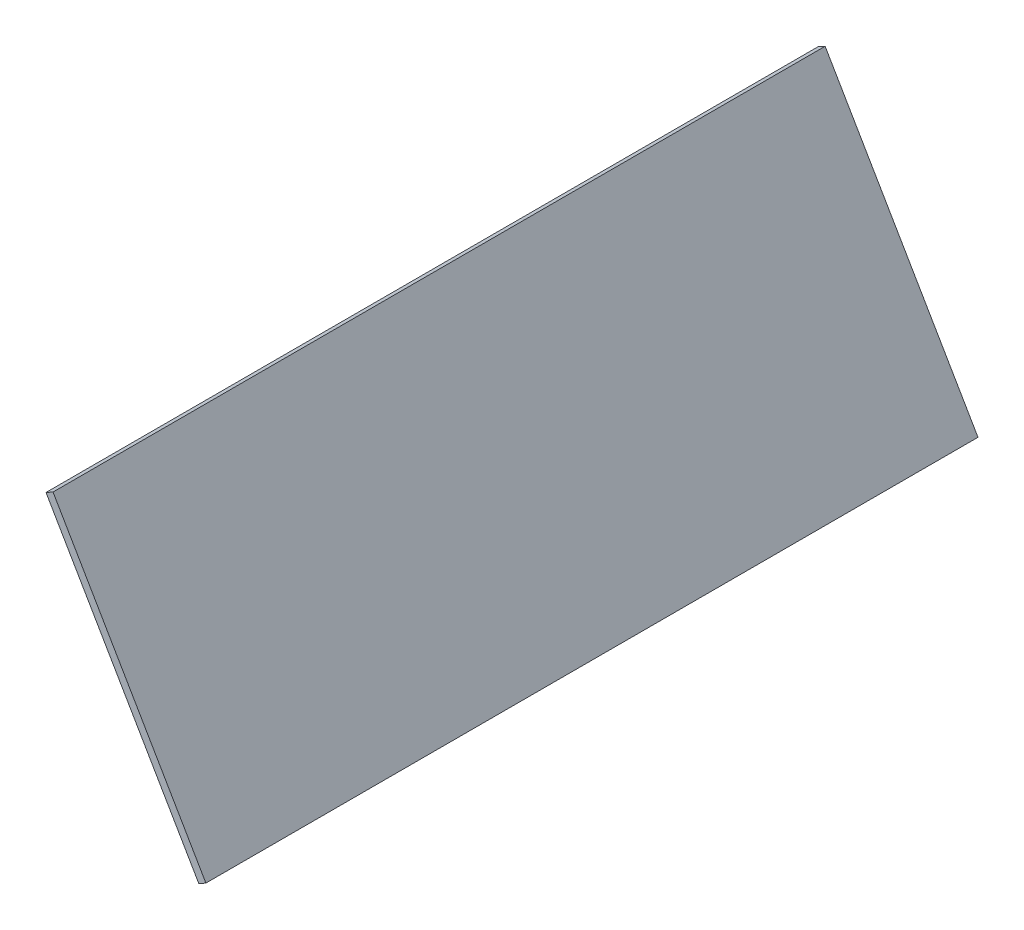
ISO-10303-21;
HEADER;
FILE_DESCRIPTION(('STEP AP214'),'2;1');
FILE_NAME('part.step','',(''),(''),'','','');
FILE_SCHEMA(('AUTOMOTIVE_DESIGN { 1 0 10303 214 1 1 1 1 }'));
ENDSEC;
DATA;
#1=APPLICATION_CONTEXT('core data for automotive mechanical design processes');
#2=APPLICATION_PROTOCOL_DEFINITION('international standard','automotive_design',2000,#1);
#3=PRODUCT_CONTEXT('',#1,'mechanical');
#4=PRODUCT('Part','Part','',(#3));
#5=PRODUCT_RELATED_PRODUCT_CATEGORY('part','',(#4));
#6=PRODUCT_DEFINITION_FORMATION('','',#4);
#7=PRODUCT_DEFINITION_CONTEXT('part definition',#1,'design');
#8=PRODUCT_DEFINITION('design','',#6,#7);
#9=PRODUCT_DEFINITION_SHAPE('','',#8);
#10=(LENGTH_UNIT() NAMED_UNIT(*) SI_UNIT(.MILLI.,.METRE.));
#11=(NAMED_UNIT(*) PLANE_ANGLE_UNIT() SI_UNIT($,.RADIAN.));
#12=(NAMED_UNIT(*) SI_UNIT($,.STERADIAN.) SOLID_ANGLE_UNIT());
#13=UNCERTAINTY_MEASURE_WITH_UNIT(LENGTH_MEASURE(1.E-05),#10,'distance_accuracy_value','');
#14=(GEOMETRIC_REPRESENTATION_CONTEXT(3) GLOBAL_UNCERTAINTY_ASSIGNED_CONTEXT((#13)) GLOBAL_UNIT_ASSIGNED_CONTEXT((#10,
#11,#12)) REPRESENTATION_CONTEXT('',''));
#15=CARTESIAN_POINT('',(0.,0.,0.));
#16=DIRECTION('',(0.,0.,1.));
#17=DIRECTION('',(1.,0.,0.));
#18=AXIS2_PLACEMENT_3D('',#15,#16,#17);
#19=CARTESIAN_POINT('',(93.2,35.7,198.));
#20=DIRECTION('',(0.864104699471883,0.503312098355094,0.));
#21=DIRECTION('',(-0.503312098355094,0.864104699471883,0.));
#22=AXIS2_PLACEMENT_3D('',#19,#20,#21);
#23=PLANE('',#22);
#24=DIRECTION('',(0.503312098355094,-0.864104699471883,0.));
#25=VECTOR('',#24,1.);
#26=CARTESIAN_POINT('',(93.2,35.7,0.));
#27=LINE('',#26,#25);
#28=CARTESIAN_POINT('',(54.,103.,0.));
#29=VERTEX_POINT('',#28);
#30=CARTESIAN_POINT('',(93.2,35.7,0.));
#31=VERTEX_POINT('',#30);
#32=EDGE_CURVE('E113',#29,#31,#27,.T.);
#33=ORIENTED_EDGE('',*,*,#32,.T.);
#34=DIRECTION('',(0.,0.,-1.));
#35=VECTOR('',#34,1.);
#36=CARTESIAN_POINT('',(93.2,35.7,198.));
#37=LINE('',#36,#35);
#38=CARTESIAN_POINT('',(93.2,35.7,198.));
#39=VERTEX_POINT('',#38);
#40=EDGE_CURVE('E11',#39,#31,#37,.T.);
#41=ORIENTED_EDGE('',*,*,#40,.F.);
#42=DIRECTION('',(0.503312098355094,-0.864104699471883,0.));
#43=VECTOR('',#42,1.);
#44=CARTESIAN_POINT('',(93.2,35.7,198.));
#45=LINE('',#44,#43);
#46=CARTESIAN_POINT('',(54.,103.,198.));
#47=VERTEX_POINT('',#46);
#48=EDGE_CURVE('E97',#47,#39,#45,.T.);
#49=ORIENTED_EDGE('',*,*,#48,.F.);
#50=DIRECTION('',(0.,0.,-1.));
#51=VECTOR('',#50,1.);
#52=CARTESIAN_POINT('',(54.,103.,198.));
#53=LINE('',#52,#51);
#54=EDGE_CURVE('E109',#47,#29,#53,.T.);
#55=ORIENTED_EDGE('',*,*,#54,.T.);
#56=EDGE_LOOP('',(#33,#41,#49,#55));
#57=FACE_BOUND('',#56,.T.);
#58=ADVANCED_FACE('F45',(#57),#23,.F.);
#59=CARTESIAN_POINT('',(95.,36.75,198.));
#60=DIRECTION('',(-0.503871025524085,0.863778900898434,0.));
#61=DIRECTION('',(-0.863778900898434,-0.503871025524085,0.));
#62=AXIS2_PLACEMENT_3D('',#59,#60,#61);
#63=PLANE('',#62);
#64=DIRECTION('',(0.863778900898434,0.503871025524085,0.));
#65=VECTOR('',#64,1.);
#66=CARTESIAN_POINT('',(95.,36.75,0.));
#67=LINE('',#66,#65);
#68=CARTESIAN_POINT('',(95.,36.75,0.));
#69=VERTEX_POINT('',#68);
#70=EDGE_CURVE('E102',#31,#69,#67,.T.);
#71=ORIENTED_EDGE('',*,*,#70,.T.);
#72=DIRECTION('',(0.,0.,-1.));
#73=VECTOR('',#72,1.);
#74=CARTESIAN_POINT('',(95.,36.75,198.));
#75=LINE('',#74,#73);
#76=CARTESIAN_POINT('',(95.,36.75,198.));
#77=VERTEX_POINT('',#76);
#78=EDGE_CURVE('E54',#77,#69,#75,.T.);
#79=ORIENTED_EDGE('',*,*,#78,.F.);
#80=DIRECTION('',(0.863778900898434,0.503871025524085,0.));
#81=VECTOR('',#80,1.);
#82=CARTESIAN_POINT('',(95.,36.75,198.));
#83=LINE('',#82,#81);
#84=EDGE_CURVE('E92',#39,#77,#83,.T.);
#85=ORIENTED_EDGE('',*,*,#84,.F.);
#86=ORIENTED_EDGE('',*,*,#40,.T.);
#87=EDGE_LOOP('',(#71,#79,#85,#86));
#88=FACE_BOUND('',#87,.T.);
#89=ADVANCED_FACE('F101',(#88),#63,.F.);
#90=CARTESIAN_POINT('',(55.8,104.,198.));
#91=DIRECTION('',(-0.863941935784377,-0.503591433200708,0.));
#92=DIRECTION('',(0.503591433200708,-0.863941935784377,0.));
#93=AXIS2_PLACEMENT_3D('',#90,#91,#92);
#94=PLANE('',#93);
#95=DIRECTION('',(-0.503591433200708,0.863941935784377,0.));
#96=VECTOR('',#95,1.);
#97=CARTESIAN_POINT('',(55.8,104.,0.));
#98=LINE('',#97,#96);
#99=CARTESIAN_POINT('',(55.8,104.,0.));
#100=VERTEX_POINT('',#99);
#101=EDGE_CURVE('E79',#69,#100,#98,.T.);
#102=ORIENTED_EDGE('',*,*,#101,.T.);
#103=DIRECTION('',(0.,0.,-1.));
#104=VECTOR('',#103,1.);
#105=CARTESIAN_POINT('',(55.8,104.,198.));
#106=LINE('',#105,#104);
#107=CARTESIAN_POINT('',(55.8,104.,198.));
#108=VERTEX_POINT('',#107);
#109=EDGE_CURVE('E104',#108,#100,#106,.T.);
#110=ORIENTED_EDGE('',*,*,#109,.F.);
#111=DIRECTION('',(-0.503591433200708,0.863941935784377,0.));
#112=VECTOR('',#111,1.);
#113=CARTESIAN_POINT('',(55.8,104.,198.));
#114=LINE('',#113,#112);
#115=EDGE_CURVE('E95',#77,#108,#114,.T.);
#116=ORIENTED_EDGE('',*,*,#115,.F.);
#117=ORIENTED_EDGE('',*,*,#78,.T.);
#118=EDGE_LOOP('',(#102,#110,#116,#117));
#119=FACE_BOUND('',#118,.T.);
#120=ADVANCED_FACE('F105',(#119),#94,.F.);
#121=CARTESIAN_POINT('',(54.,103.,198.));
#122=DIRECTION('',(0.485642931178633,-0.874157276121537,0.));
#123=DIRECTION('',(0.874157276121537,0.485642931178633,0.));
#124=AXIS2_PLACEMENT_3D('',#121,#122,#123);
#125=PLANE('',#124);
#126=DIRECTION('',(-0.874157276121537,-0.485642931178633,0.));
#127=VECTOR('',#126,1.);
#128=CARTESIAN_POINT('',(54.,103.,0.));
#129=LINE('',#128,#127);
#130=EDGE_CURVE('E85',#100,#29,#129,.T.);
#131=ORIENTED_EDGE('',*,*,#130,.T.);
#132=ORIENTED_EDGE('',*,*,#54,.F.);
#133=DIRECTION('',(-0.874157276121537,-0.485642931178633,0.));
#134=VECTOR('',#133,1.);
#135=CARTESIAN_POINT('',(54.,103.,198.));
#136=LINE('',#135,#134);
#137=EDGE_CURVE('E62',#108,#47,#136,.T.);
#138=ORIENTED_EDGE('',*,*,#137,.F.);
#139=ORIENTED_EDGE('',*,*,#109,.T.);
#140=EDGE_LOOP('',(#131,#132,#138,#139));
#141=FACE_BOUND('',#140,.T.);
#142=ADVANCED_FACE('F127',(#141),#125,.F.);
#143=CARTESIAN_POINT('',(0.,0.,198.));
#144=DIRECTION('',(0.,0.,1.));
#145=DIRECTION('',(1.,0.,0.));
#146=AXIS2_PLACEMENT_3D('',#143,#144,#145);
#147=PLANE('',#146);
#148=ORIENTED_EDGE('',*,*,#48,.T.);
#149=ORIENTED_EDGE('',*,*,#84,.T.);
#150=ORIENTED_EDGE('',*,*,#115,.T.);
#151=ORIENTED_EDGE('',*,*,#137,.T.);
#152=EDGE_LOOP('',(#148,#149,#150,#151));
#153=FACE_BOUND('',#152,.T.);
#154=ADVANCED_FACE('F93',(#153),#147,.T.);
#155=CARTESIAN_POINT('',(0.,0.,0.));
#156=DIRECTION('',(0.,0.,1.));
#157=DIRECTION('',(1.,0.,0.));
#158=AXIS2_PLACEMENT_3D('',#155,#156,#157);
#159=PLANE('',#158);
#160=ORIENTED_EDGE('',*,*,#32,.F.);
#161=ORIENTED_EDGE('',*,*,#130,.F.);
#162=ORIENTED_EDGE('',*,*,#101,.F.);
#163=ORIENTED_EDGE('',*,*,#70,.F.);
#164=EDGE_LOOP('',(#160,#161,#162,#163));
#165=FACE_BOUND('',#164,.T.);
#166=ADVANCED_FACE('F130',(#165),#159,.F.);
#167=CLOSED_SHELL('',(#58,#89,#120,#142,#154,#166));
#168=MANIFOLD_SOLID_BREP('B2',#167);
#169=ADVANCED_BREP_SHAPE_REPRESENTATION('',(#18,#168),#14);
#170=SHAPE_DEFINITION_REPRESENTATION(#9,#169);
ENDSEC;
END-ISO-10303-21;
